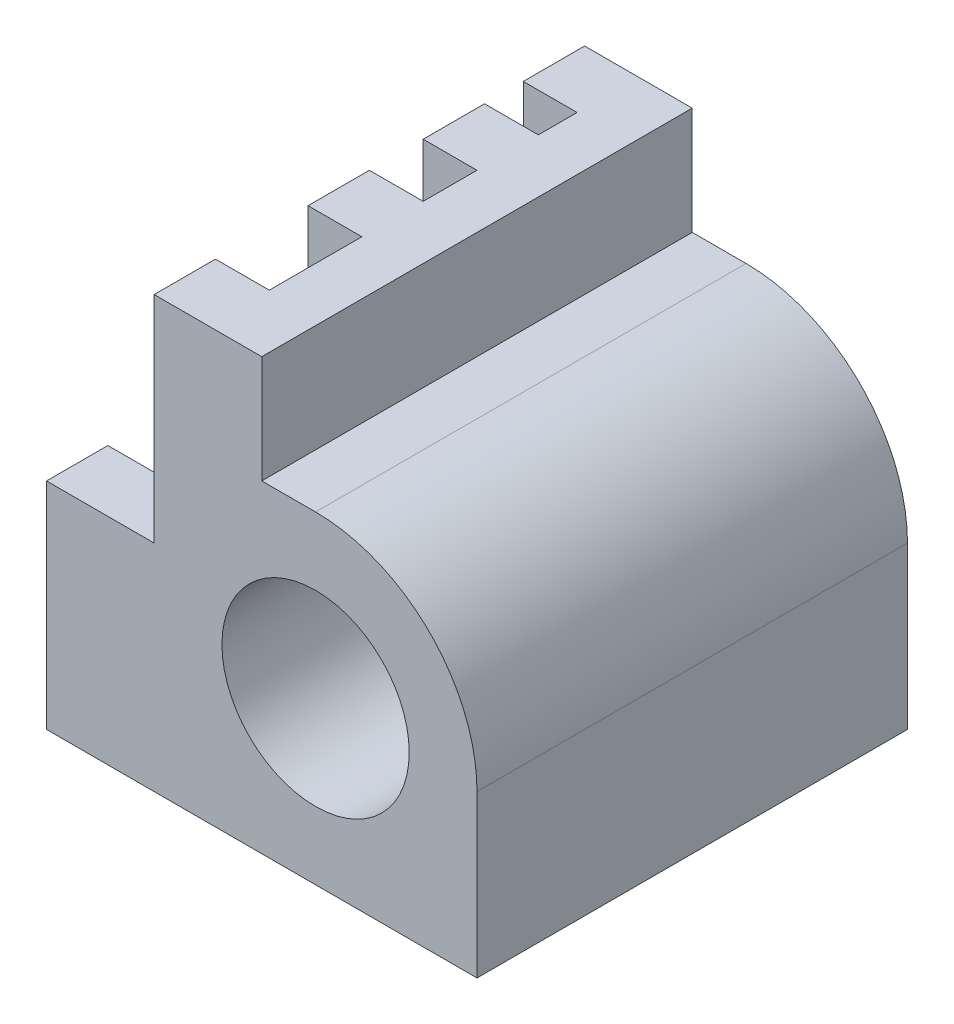
ISO-10303-21;
HEADER;
FILE_DESCRIPTION(('STEP AP214'),'2;1');
FILE_NAME('part.step','',(''),(''),'','','');
FILE_SCHEMA(('AUTOMOTIVE_DESIGN { 1 0 10303 214 1 1 1 1 }'));
ENDSEC;
DATA;
#1=APPLICATION_CONTEXT('core data for automotive mechanical design processes');
#2=APPLICATION_PROTOCOL_DEFINITION('international standard','automotive_design',2000,#1);
#3=PRODUCT_CONTEXT('',#1,'mechanical');
#4=PRODUCT('Part','Part','',(#3));
#5=PRODUCT_RELATED_PRODUCT_CATEGORY('part','',(#4));
#6=PRODUCT_DEFINITION_FORMATION('','',#4);
#7=PRODUCT_DEFINITION_CONTEXT('part definition',#1,'design');
#8=PRODUCT_DEFINITION('design','',#6,#7);
#9=PRODUCT_DEFINITION_SHAPE('','',#8);
#10=(LENGTH_UNIT() NAMED_UNIT(*) SI_UNIT(.MILLI.,.METRE.));
#11=(NAMED_UNIT(*) PLANE_ANGLE_UNIT() SI_UNIT($,.RADIAN.));
#12=(NAMED_UNIT(*) SI_UNIT($,.STERADIAN.) SOLID_ANGLE_UNIT());
#13=UNCERTAINTY_MEASURE_WITH_UNIT(LENGTH_MEASURE(1.E-05),#10,'distance_accuracy_value','');
#14=(GEOMETRIC_REPRESENTATION_CONTEXT(3) GLOBAL_UNCERTAINTY_ASSIGNED_CONTEXT((#13)) GLOBAL_UNIT_ASSIGNED_CONTEXT((#10,
#11,#12)) REPRESENTATION_CONTEXT('',''));
#15=CARTESIAN_POINT('',(0.,0.,0.));
#16=DIRECTION('',(0.,0.,1.));
#17=DIRECTION('',(1.,0.,0.));
#18=AXIS2_PLACEMENT_3D('',#15,#16,#17);
#19=CARTESIAN_POINT('',(5.,20.,20.));
#20=DIRECTION('',(1.,0.,0.));
#21=DIRECTION('',(0.,1.,0.));
#22=AXIS2_PLACEMENT_3D('',#19,#20,#21);
#23=PLANE('',#22);
#24=DIRECTION('',(0.,0.,-1.));
#25=VECTOR('',#24,1.);
#26=CARTESIAN_POINT('',(5.,10.,20.));
#27=LINE('',#26,#25);
#28=CARTESIAN_POINT('',(5.,10.,2.85));
#29=VERTEX_POINT('',#28);
#30=CARTESIAN_POINT('',(5.,10.,0.));
#31=VERTEX_POINT('',#30);
#32=EDGE_CURVE('E375',#29,#31,#27,.T.);
#33=ORIENTED_EDGE('',*,*,#32,.F.);
#34=DIRECTION('',(0.,1.,0.));
#35=VECTOR('',#34,1.);
#36=CARTESIAN_POINT('',(5.,20.,2.85));
#37=LINE('',#36,#35);
#38=CARTESIAN_POINT('',(5.,20.,2.85));
#39=VERTEX_POINT('',#38);
#40=EDGE_CURVE('E321',#29,#39,#37,.T.);
#41=ORIENTED_EDGE('',*,*,#40,.T.);
#42=DIRECTION('',(0.,0.,-1.));
#43=VECTOR('',#42,1.);
#44=CARTESIAN_POINT('',(5.,20.,20.));
#45=LINE('',#44,#43);
#46=CARTESIAN_POINT('',(5.,20.,0.));
#47=VERTEX_POINT('',#46);
#48=EDGE_CURVE('E380',#39,#47,#45,.T.);
#49=ORIENTED_EDGE('',*,*,#48,.T.);
#50=DIRECTION('',(0.,-1.,0.));
#51=VECTOR('',#50,1.);
#52=CARTESIAN_POINT('',(5.,20.,0.));
#53=LINE('',#52,#51);
#54=EDGE_CURVE('E367',#47,#31,#53,.T.);
#55=ORIENTED_EDGE('',*,*,#54,.T.);
#56=EDGE_LOOP('',(#33,#41,#49,#55));
#57=FACE_BOUND('',#56,.T.);
#58=ADVANCED_FACE('F40',(#57),#23,.F.);
#59=CARTESIAN_POINT('',(5.,20.,7.5));
#60=VERTEX_POINT('',#59);
#61=CARTESIAN_POINT('',(5.,20.,4.65));
#62=VERTEX_POINT('',#61);
#63=EDGE_CURVE('E480',#60,#62,#45,.T.);
#64=ORIENTED_EDGE('',*,*,#63,.T.);
#65=DIRECTION('',(0.,-1.,0.));
#66=VECTOR('',#65,1.);
#67=CARTESIAN_POINT('',(5.,20.,4.65));
#68=LINE('',#67,#66);
#69=CARTESIAN_POINT('',(5.,10.,4.65));
#70=VERTEX_POINT('',#69);
#71=EDGE_CURVE('E318',#62,#70,#68,.T.);
#72=ORIENTED_EDGE('',*,*,#71,.T.);
#73=CARTESIAN_POINT('',(5.,10.,7.5));
#74=VERTEX_POINT('',#73);
#75=EDGE_CURVE('E420',#74,#70,#27,.T.);
#76=ORIENTED_EDGE('',*,*,#75,.F.);
#77=DIRECTION('',(0.,1.,0.));
#78=VECTOR('',#77,1.);
#79=CARTESIAN_POINT('',(5.,20.,7.5));
#80=LINE('',#79,#78);
#81=EDGE_CURVE('E315',#74,#60,#80,.T.);
#82=ORIENTED_EDGE('',*,*,#81,.T.);
#83=EDGE_LOOP('',(#64,#72,#76,#82));
#84=FACE_BOUND('',#83,.T.);
#85=ADVANCED_FACE('F513',(#84),#23,.F.);
#86=CARTESIAN_POINT('',(5.,20.,12.85));
#87=VERTEX_POINT('',#86);
#88=CARTESIAN_POINT('',(5.,20.,10.));
#89=VERTEX_POINT('',#88);
#90=EDGE_CURVE('E386',#87,#89,#45,.T.);
#91=ORIENTED_EDGE('',*,*,#90,.T.);
#92=DIRECTION('',(0.,-1.,0.));
#93=VECTOR('',#92,1.);
#94=CARTESIAN_POINT('',(5.,20.,10.));
#95=LINE('',#94,#93);
#96=CARTESIAN_POINT('',(5.,10.,10.));
#97=VERTEX_POINT('',#96);
#98=EDGE_CURVE('E312',#89,#97,#95,.T.);
#99=ORIENTED_EDGE('',*,*,#98,.T.);
#100=CARTESIAN_POINT('',(5.,10.,12.85));
#101=VERTEX_POINT('',#100);
#102=EDGE_CURVE('E381',#101,#97,#27,.T.);
#103=ORIENTED_EDGE('',*,*,#102,.F.);
#104=DIRECTION('',(0.,1.,0.));
#105=VECTOR('',#104,1.);
#106=CARTESIAN_POINT('',(5.,20.,12.85));
#107=LINE('',#106,#105);
#108=EDGE_CURVE('E309',#101,#87,#107,.T.);
#109=ORIENTED_EDGE('',*,*,#108,.T.);
#110=EDGE_LOOP('',(#91,#99,#103,#109));
#111=FACE_BOUND('',#110,.T.);
#112=ADVANCED_FACE('F478',(#111),#23,.F.);
#113=CARTESIAN_POINT('',(5.,10.,20.));
#114=DIRECTION('',(0.,-1.,0.));
#115=DIRECTION('',(0.,0.,-1.));
#116=AXIS2_PLACEMENT_3D('',#113,#114,#115);
#117=PLANE('',#116);
#118=DIRECTION('',(0.,0.,-1.));
#119=VECTOR('',#118,1.);
#120=CARTESIAN_POINT('',(0.,10.,20.));
#121=LINE('',#120,#119);
#122=CARTESIAN_POINT('',(0.,10.,2.85));
#123=VERTEX_POINT('',#122);
#124=CARTESIAN_POINT('',(0.,10.,0.));
#125=VERTEX_POINT('',#124);
#126=EDGE_CURVE('E351',#123,#125,#121,.T.);
#127=ORIENTED_EDGE('',*,*,#126,.F.);
#128=DIRECTION('',(1.,0.,0.));
#129=VECTOR('',#128,1.);
#130=CARTESIAN_POINT('',(5.,10.,2.85));
#131=LINE('',#130,#129);
#132=EDGE_CURVE('E13',#123,#29,#131,.T.);
#133=ORIENTED_EDGE('',*,*,#132,.T.);
#134=ORIENTED_EDGE('',*,*,#32,.T.);
#135=DIRECTION('',(-1.,0.,0.));
#136=VECTOR('',#135,1.);
#137=CARTESIAN_POINT('',(5.,10.,0.));
#138=LINE('',#137,#136);
#139=EDGE_CURVE('E335',#31,#125,#138,.T.);
#140=ORIENTED_EDGE('',*,*,#139,.T.);
#141=EDGE_LOOP('',(#127,#133,#134,#140));
#142=FACE_BOUND('',#141,.T.);
#143=ADVANCED_FACE('F427',(#142),#117,.F.);
#144=ORIENTED_EDGE('',*,*,#75,.T.);
#145=DIRECTION('',(-1.,0.,0.));
#146=VECTOR('',#145,1.);
#147=CARTESIAN_POINT('',(5.,10.,4.65));
#148=LINE('',#147,#146);
#149=CARTESIAN_POINT('',(0.,10.,4.65));
#150=VERTEX_POINT('',#149);
#151=EDGE_CURVE('E48',#70,#150,#148,.T.);
#152=ORIENTED_EDGE('',*,*,#151,.T.);
#153=CARTESIAN_POINT('',(0.,10.,7.5));
#154=VERTEX_POINT('',#153);
#155=EDGE_CURVE('E418',#154,#150,#121,.T.);
#156=ORIENTED_EDGE('',*,*,#155,.F.);
#157=DIRECTION('',(1.,0.,0.));
#158=VECTOR('',#157,1.);
#159=CARTESIAN_POINT('',(5.,10.,7.5));
#160=LINE('',#159,#158);
#161=EDGE_CURVE('E412',#154,#74,#160,.T.);
#162=ORIENTED_EDGE('',*,*,#161,.T.);
#163=EDGE_LOOP('',(#144,#152,#156,#162));
#164=FACE_BOUND('',#163,.T.);
#165=ADVANCED_FACE('F417',(#164),#117,.F.);
#166=ORIENTED_EDGE('',*,*,#102,.T.);
#167=DIRECTION('',(-1.,0.,0.));
#168=VECTOR('',#167,1.);
#169=CARTESIAN_POINT('',(5.,10.,10.));
#170=LINE('',#169,#168);
#171=CARTESIAN_POINT('',(0.,10.,10.));
#172=VERTEX_POINT('',#171);
#173=EDGE_CURVE('E410',#97,#172,#170,.T.);
#174=ORIENTED_EDGE('',*,*,#173,.T.);
#175=CARTESIAN_POINT('',(0.,10.,12.85));
#176=VERTEX_POINT('',#175);
#177=EDGE_CURVE('E376',#176,#172,#121,.T.);
#178=ORIENTED_EDGE('',*,*,#177,.F.);
#179=DIRECTION('',(1.,0.,0.));
#180=VECTOR('',#179,1.);
#181=CARTESIAN_POINT('',(5.,10.,12.85));
#182=LINE('',#181,#180);
#183=EDGE_CURVE('E407',#176,#101,#182,.T.);
#184=ORIENTED_EDGE('',*,*,#183,.T.);
#185=EDGE_LOOP('',(#166,#174,#178,#184));
#186=FACE_BOUND('',#185,.T.);
#187=ADVANCED_FACE('F472',(#186),#117,.F.);
#188=CARTESIAN_POINT('',(12.5,7.5,20.));
#189=DIRECTION('',(0.,0.,1.));
#190=DIRECTION('',(1.,0.,0.));
#191=AXIS2_PLACEMENT_3D('',#188,#189,#190);
#192=PLANE('',#191);
#193=DIRECTION('',(0.,-1.,0.));
#194=VECTOR('',#193,1.);
#195=CARTESIAN_POINT('',(0.,10.,20.));
#196=LINE('',#195,#194);
#197=CARTESIAN_POINT('',(0.,10.,20.));
#198=VERTEX_POINT('',#197);
#199=CARTESIAN_POINT('',(0.,0.,20.));
#200=VERTEX_POINT('',#199);
#201=EDGE_CURVE('E331',#198,#200,#196,.T.);
#202=ORIENTED_EDGE('',*,*,#201,.T.);
#203=DIRECTION('',(1.,0.,0.));
#204=VECTOR('',#203,1.);
#205=CARTESIAN_POINT('',(0.,0.,20.));
#206=LINE('',#205,#204);
#207=CARTESIAN_POINT('',(20.,0.,20.));
#208=VERTEX_POINT('',#207);
#209=EDGE_CURVE('E334',#200,#208,#206,.T.);
#210=ORIENTED_EDGE('',*,*,#209,.T.);
#211=DIRECTION('',(0.,1.,0.));
#212=VECTOR('',#211,1.);
#213=CARTESIAN_POINT('',(20.,0.,20.));
#214=LINE('',#213,#212);
#215=CARTESIAN_POINT('',(20.,7.5,20.));
#216=VERTEX_POINT('',#215);
#217=EDGE_CURVE('E337',#208,#216,#214,.T.);
#218=ORIENTED_EDGE('',*,*,#217,.T.);
#219=CARTESIAN_POINT('',(12.5,7.5,20.));
#220=DIRECTION('',(0.,0.,1.));
#221=DIRECTION('',(1.,0.,0.));
#222=AXIS2_PLACEMENT_3D('',#219,#220,#221);
#223=CIRCLE('',#222,7.5);
#224=CARTESIAN_POINT('',(12.5,15.,20.));
#225=VERTEX_POINT('',#224);
#226=EDGE_CURVE('E339',#216,#225,#223,.T.);
#227=ORIENTED_EDGE('',*,*,#226,.T.);
#228=DIRECTION('',(-1.,0.,0.));
#229=VECTOR('',#228,1.);
#230=CARTESIAN_POINT('',(12.5,15.,20.));
#231=LINE('',#230,#229);
#232=CARTESIAN_POINT('',(10.,15.,20.));
#233=VERTEX_POINT('',#232);
#234=EDGE_CURVE('E341',#225,#233,#231,.T.);
#235=ORIENTED_EDGE('',*,*,#234,.T.);
#236=DIRECTION('',(0.,1.,0.));
#237=VECTOR('',#236,1.);
#238=CARTESIAN_POINT('',(10.,15.,20.));
#239=LINE('',#238,#237);
#240=CARTESIAN_POINT('',(10.,20.,20.));
#241=VERTEX_POINT('',#240);
#242=EDGE_CURVE('E343',#233,#241,#239,.T.);
#243=ORIENTED_EDGE('',*,*,#242,.T.);
#244=DIRECTION('',(-1.,0.,0.));
#245=VECTOR('',#244,1.);
#246=CARTESIAN_POINT('',(10.,20.,20.));
#247=LINE('',#246,#245);
#248=CARTESIAN_POINT('',(5.,20.,20.));
#249=VERTEX_POINT('',#248);
#250=EDGE_CURVE('E345',#241,#249,#247,.T.);
#251=ORIENTED_EDGE('',*,*,#250,.T.);
#252=DIRECTION('',(0.,-1.,0.));
#253=VECTOR('',#252,1.);
#254=CARTESIAN_POINT('',(5.,20.,20.));
#255=LINE('',#254,#253);
#256=CARTESIAN_POINT('',(5.,10.,20.));
#257=VERTEX_POINT('',#256);
#258=EDGE_CURVE('E347',#249,#257,#255,.T.);
#259=ORIENTED_EDGE('',*,*,#258,.T.);
#260=DIRECTION('',(-1.,0.,0.));
#261=VECTOR('',#260,1.);
#262=CARTESIAN_POINT('',(5.,10.,20.));
#263=LINE('',#262,#261);
#264=EDGE_CURVE('E349',#257,#198,#263,.T.);
#265=ORIENTED_EDGE('',*,*,#264,.T.);
#266=EDGE_LOOP('',(#202,#210,#218,#227,#235,#243,#251,#259,#265));
#267=FACE_BOUND('',#266,.T.);
#268=CARTESIAN_POINT('',(12.5,7.5,20.));
#269=DIRECTION('',(0.,0.,1.));
#270=DIRECTION('',(1.,0.,0.));
#271=AXIS2_PLACEMENT_3D('',#268,#269,#270);
#272=CIRCLE('',#271,4.35);
#273=CARTESIAN_POINT('',(16.85,7.5,20.));
#274=VERTEX_POINT('',#273);
#275=EDGE_CURVE('E325',#274,#274,#272,.T.);
#276=ORIENTED_EDGE('',*,*,#275,.F.);
#277=EDGE_LOOP('',(#276));
#278=FACE_BOUND('',#277,.T.);
#279=ADVANCED_FACE('F442',(#267,#278),#192,.T.);
#280=CARTESIAN_POINT('',(12.5,7.5,0.));
#281=DIRECTION('',(0.,0.,1.));
#282=DIRECTION('',(1.,0.,0.));
#283=AXIS2_PLACEMENT_3D('',#280,#281,#282);
#284=PLANE('',#283);
#285=DIRECTION('',(0.,-1.,0.));
#286=VECTOR('',#285,1.);
#287=CARTESIAN_POINT('',(0.,10.,0.));
#288=LINE('',#287,#286);
#289=CARTESIAN_POINT('',(0.,0.,0.));
#290=VERTEX_POINT('',#289);
#291=EDGE_CURVE('E328',#125,#290,#288,.T.);
#292=ORIENTED_EDGE('',*,*,#291,.F.);
#293=ORIENTED_EDGE('',*,*,#139,.F.);
#294=ORIENTED_EDGE('',*,*,#54,.F.);
#295=DIRECTION('',(-1.,0.,0.));
#296=VECTOR('',#295,1.);
#297=CARTESIAN_POINT('',(10.,20.,0.));
#298=LINE('',#297,#296);
#299=CARTESIAN_POINT('',(10.,20.,0.));
#300=VERTEX_POINT('',#299);
#301=EDGE_CURVE('E364',#300,#47,#298,.T.);
#302=ORIENTED_EDGE('',*,*,#301,.F.);
#303=DIRECTION('',(0.,1.,0.));
#304=VECTOR('',#303,1.);
#305=CARTESIAN_POINT('',(10.,15.,0.));
#306=LINE('',#305,#304);
#307=CARTESIAN_POINT('',(10.,15.,0.));
#308=VERTEX_POINT('',#307);
#309=EDGE_CURVE('E362',#308,#300,#306,.T.);
#310=ORIENTED_EDGE('',*,*,#309,.F.);
#311=DIRECTION('',(-1.,0.,0.));
#312=VECTOR('',#311,1.);
#313=CARTESIAN_POINT('',(12.5,15.,0.));
#314=LINE('',#313,#312);
#315=CARTESIAN_POINT('',(12.5,15.,0.));
#316=VERTEX_POINT('',#315);
#317=EDGE_CURVE('E360',#316,#308,#314,.T.);
#318=ORIENTED_EDGE('',*,*,#317,.F.);
#319=CARTESIAN_POINT('',(12.5,7.5,0.));
#320=DIRECTION('',(0.,0.,1.));
#321=DIRECTION('',(1.,0.,0.));
#322=AXIS2_PLACEMENT_3D('',#319,#320,#321);
#323=CIRCLE('',#322,7.5);
#324=CARTESIAN_POINT('',(20.,7.5,0.));
#325=VERTEX_POINT('',#324);
#326=EDGE_CURVE('E358',#325,#316,#323,.T.);
#327=ORIENTED_EDGE('',*,*,#326,.F.);
#328=DIRECTION('',(0.,1.,0.));
#329=VECTOR('',#328,1.);
#330=CARTESIAN_POINT('',(20.,0.,0.));
#331=LINE('',#330,#329);
#332=CARTESIAN_POINT('',(20.,0.,0.));
#333=VERTEX_POINT('',#332);
#334=EDGE_CURVE('E356',#333,#325,#331,.T.);
#335=ORIENTED_EDGE('',*,*,#334,.F.);
#336=DIRECTION('',(1.,0.,0.));
#337=VECTOR('',#336,1.);
#338=CARTESIAN_POINT('',(0.,0.,0.));
#339=LINE('',#338,#337);
#340=EDGE_CURVE('E354',#290,#333,#339,.T.);
#341=ORIENTED_EDGE('',*,*,#340,.F.);
#342=EDGE_LOOP('',(#292,#293,#294,#302,#310,#318,#327,#335,#341));
#343=FACE_BOUND('',#342,.T.);
#344=CARTESIAN_POINT('',(12.5,7.5,0.));
#345=DIRECTION('',(0.,0.,1.));
#346=DIRECTION('',(1.,0.,0.));
#347=AXIS2_PLACEMENT_3D('',#344,#345,#346);
#348=CIRCLE('',#347,4.35);
#349=CARTESIAN_POINT('',(16.85,7.5,0.));
#350=VERTEX_POINT('',#349);
#351=EDGE_CURVE('E324',#350,#350,#348,.T.);
#352=ORIENTED_EDGE('',*,*,#351,.T.);
#353=EDGE_LOOP('',(#352));
#354=FACE_BOUND('',#353,.T.);
#355=ADVANCED_FACE('F431',(#343,#354),#284,.F.);
#356=CARTESIAN_POINT('',(0.,10.,20.));
#357=DIRECTION('',(1.,0.,0.));
#358=DIRECTION('',(0.,1.,0.));
#359=AXIS2_PLACEMENT_3D('',#356,#357,#358);
#360=PLANE('',#359);
#361=DIRECTION('',(0.,0.,1.));
#362=VECTOR('',#361,1.);
#363=CARTESIAN_POINT('',(0.,7.5,2.85));
#364=LINE('',#363,#362);
#365=CARTESIAN_POINT('',(0.,7.5,2.85));
#366=VERTEX_POINT('',#365);
#367=CARTESIAN_POINT('',(0.,7.5,4.65));
#368=VERTEX_POINT('',#367);
#369=EDGE_CURVE('E226',#366,#368,#364,.T.);
#370=ORIENTED_EDGE('',*,*,#369,.F.);
#371=DIRECTION('',(0.,1.,0.));
#372=VECTOR('',#371,1.);
#373=CARTESIAN_POINT('',(0.,-3.64522989862039,2.85));
#374=LINE('',#373,#372);
#375=EDGE_CURVE('E218',#366,#123,#374,.T.);
#376=ORIENTED_EDGE('',*,*,#375,.T.);
#377=ORIENTED_EDGE('',*,*,#126,.T.);
#378=ORIENTED_EDGE('',*,*,#291,.T.);
#379=DIRECTION('',(0.,0.,-1.));
#380=VECTOR('',#379,1.);
#381=CARTESIAN_POINT('',(0.,0.,20.));
#382=LINE('',#381,#380);
#383=EDGE_CURVE('E401',#200,#290,#382,.T.);
#384=ORIENTED_EDGE('',*,*,#383,.F.);
#385=ORIENTED_EDGE('',*,*,#201,.F.);
#386=CARTESIAN_POINT('',(0.,10.,17.15));
#387=VERTEX_POINT('',#386);
#388=EDGE_CURVE('E372',#198,#387,#121,.T.);
#389=ORIENTED_EDGE('',*,*,#388,.T.);
#390=DIRECTION('',(0.,1.,0.));
#391=VECTOR('',#390,1.);
#392=CARTESIAN_POINT('',(0.,-3.64522989862039,17.15));
#393=LINE('',#392,#391);
#394=CARTESIAN_POINT('',(0.,7.5,17.15));
#395=VERTEX_POINT('',#394);
#396=EDGE_CURVE('E297',#395,#387,#393,.T.);
#397=ORIENTED_EDGE('',*,*,#396,.F.);
#398=DIRECTION('',(0.,0.,1.));
#399=VECTOR('',#398,1.);
#400=CARTESIAN_POINT('',(0.,7.5,12.85));
#401=LINE('',#400,#399);
#402=CARTESIAN_POINT('',(0.,7.5,12.85));
#403=VERTEX_POINT('',#402);
#404=EDGE_CURVE('E298',#403,#395,#401,.T.);
#405=ORIENTED_EDGE('',*,*,#404,.F.);
#406=DIRECTION('',(0.,1.,0.));
#407=VECTOR('',#406,1.);
#408=CARTESIAN_POINT('',(0.,-3.64522989862039,12.85));
#409=LINE('',#408,#407);
#410=EDGE_CURVE('E289',#403,#176,#409,.T.);
#411=ORIENTED_EDGE('',*,*,#410,.T.);
#412=ORIENTED_EDGE('',*,*,#177,.T.);
#413=DIRECTION('',(0.,1.,0.));
#414=VECTOR('',#413,1.);
#415=CARTESIAN_POINT('',(0.,-3.64522989862039,10.));
#416=LINE('',#415,#414);
#417=CARTESIAN_POINT('',(0.,7.5,10.));
#418=VERTEX_POINT('',#417);
#419=EDGE_CURVE('E63',#418,#172,#416,.T.);
#420=ORIENTED_EDGE('',*,*,#419,.F.);
#421=DIRECTION('',(0.,0.,1.));
#422=VECTOR('',#421,1.);
#423=CARTESIAN_POINT('',(0.,7.5,7.5));
#424=LINE('',#423,#422);
#425=CARTESIAN_POINT('',(0.,7.5,7.5));
#426=VERTEX_POINT('',#425);
#427=EDGE_CURVE('E269',#426,#418,#424,.T.);
#428=ORIENTED_EDGE('',*,*,#427,.F.);
#429=DIRECTION('',(0.,1.,0.));
#430=VECTOR('',#429,1.);
#431=CARTESIAN_POINT('',(0.,-3.64522989862039,7.5));
#432=LINE('',#431,#430);
#433=EDGE_CURVE('E260',#426,#154,#432,.T.);
#434=ORIENTED_EDGE('',*,*,#433,.T.);
#435=ORIENTED_EDGE('',*,*,#155,.T.);
#436=DIRECTION('',(0.,1.,0.));
#437=VECTOR('',#436,1.);
#438=CARTESIAN_POINT('',(0.,-3.64522989862039,4.65));
#439=LINE('',#438,#437);
#440=EDGE_CURVE('E55',#368,#150,#439,.T.);
#441=ORIENTED_EDGE('',*,*,#440,.F.);
#442=EDGE_LOOP('',(#370,#376,#377,#378,#384,#385,#389,#397,#405,#411,#412,#420,#428,#434,#435,#441));
#443=FACE_BOUND('',#442,.T.);
#444=ADVANCED_FACE('F42',(#443),#360,.F.);
#445=CARTESIAN_POINT('',(0.,0.,20.));
#446=DIRECTION('',(0.,1.,0.));
#447=DIRECTION('',(0.,0.,1.));
#448=AXIS2_PLACEMENT_3D('',#445,#446,#447);
#449=PLANE('',#448);
#450=ORIENTED_EDGE('',*,*,#340,.T.);
#451=DIRECTION('',(0.,0.,-1.));
#452=VECTOR('',#451,1.);
#453=CARTESIAN_POINT('',(20.,0.,20.));
#454=LINE('',#453,#452);
#455=EDGE_CURVE('E398',#208,#333,#454,.T.);
#456=ORIENTED_EDGE('',*,*,#455,.F.);
#457=ORIENTED_EDGE('',*,*,#209,.F.);
#458=ORIENTED_EDGE('',*,*,#383,.T.);
#459=EDGE_LOOP('',(#450,#456,#457,#458));
#460=FACE_BOUND('',#459,.T.);
#461=ADVANCED_FACE('F437',(#460),#449,.F.);
#462=CARTESIAN_POINT('',(20.,0.,20.));
#463=DIRECTION('',(-1.,0.,0.));
#464=DIRECTION('',(0.,0.,1.));
#465=AXIS2_PLACEMENT_3D('',#462,#463,#464);
#466=PLANE('',#465);
#467=ORIENTED_EDGE('',*,*,#334,.T.);
#468=DIRECTION('',(0.,0.,-1.));
#469=VECTOR('',#468,1.);
#470=CARTESIAN_POINT('',(20.,7.5,20.));
#471=LINE('',#470,#469);
#472=EDGE_CURVE('E395',#216,#325,#471,.T.);
#473=ORIENTED_EDGE('',*,*,#472,.F.);
#474=ORIENTED_EDGE('',*,*,#217,.F.);
#475=ORIENTED_EDGE('',*,*,#455,.T.);
#476=EDGE_LOOP('',(#467,#473,#474,#475));
#477=FACE_BOUND('',#476,.T.);
#478=ADVANCED_FACE('F504',(#477),#466,.F.);
#479=CARTESIAN_POINT('',(12.5,7.5,20.));
#480=DIRECTION('',(0.,0.,-1.));
#481=DIRECTION('',(-1.,0.,0.));
#482=AXIS2_PLACEMENT_3D('',#479,#480,#481);
#483=CYLINDRICAL_SURFACE('',#482,7.5);
#484=ORIENTED_EDGE('',*,*,#326,.T.);
#485=DIRECTION('',(0.,0.,-1.));
#486=VECTOR('',#485,1.);
#487=CARTESIAN_POINT('',(12.5,15.,20.));
#488=LINE('',#487,#486);
#489=EDGE_CURVE('E392',#225,#316,#488,.T.);
#490=ORIENTED_EDGE('',*,*,#489,.F.);
#491=ORIENTED_EDGE('',*,*,#226,.F.);
#492=ORIENTED_EDGE('',*,*,#472,.T.);
#493=EDGE_LOOP('',(#484,#490,#491,#492));
#494=FACE_BOUND('',#493,.T.);
#495=ADVANCED_FACE('F500',(#494),#483,.T.);
#496=CARTESIAN_POINT('',(12.5,15.,20.));
#497=DIRECTION('',(0.,-1.,0.));
#498=DIRECTION('',(0.,0.,-1.));
#499=AXIS2_PLACEMENT_3D('',#496,#497,#498);
#500=PLANE('',#499);
#501=ORIENTED_EDGE('',*,*,#317,.T.);
#502=DIRECTION('',(0.,0.,-1.));
#503=VECTOR('',#502,1.);
#504=CARTESIAN_POINT('',(10.,15.,20.));
#505=LINE('',#504,#503);
#506=EDGE_CURVE('E389',#233,#308,#505,.T.);
#507=ORIENTED_EDGE('',*,*,#506,.F.);
#508=ORIENTED_EDGE('',*,*,#234,.F.);
#509=ORIENTED_EDGE('',*,*,#489,.T.);
#510=EDGE_LOOP('',(#501,#507,#508,#509));
#511=FACE_BOUND('',#510,.T.);
#512=ADVANCED_FACE('F496',(#511),#500,.F.);
#513=CARTESIAN_POINT('',(10.,15.,20.));
#514=DIRECTION('',(-1.,0.,0.));
#515=DIRECTION('',(0.,0.,1.));
#516=AXIS2_PLACEMENT_3D('',#513,#514,#515);
#517=PLANE('',#516);
#518=ORIENTED_EDGE('',*,*,#309,.T.);
#519=DIRECTION('',(0.,0.,-1.));
#520=VECTOR('',#519,1.);
#521=CARTESIAN_POINT('',(10.,20.,20.));
#522=LINE('',#521,#520);
#523=EDGE_CURVE('E385',#241,#300,#522,.T.);
#524=ORIENTED_EDGE('',*,*,#523,.F.);
#525=ORIENTED_EDGE('',*,*,#242,.F.);
#526=ORIENTED_EDGE('',*,*,#506,.T.);
#527=EDGE_LOOP('',(#518,#524,#525,#526));
#528=FACE_BOUND('',#527,.T.);
#529=ADVANCED_FACE('F491',(#528),#517,.F.);
#530=CARTESIAN_POINT('',(10.,20.,20.));
#531=DIRECTION('',(0.,-1.,0.));
#532=DIRECTION('',(1.,0.,0.));
#533=AXIS2_PLACEMENT_3D('',#530,#531,#532);
#534=PLANE('',#533);
#535=ORIENTED_EDGE('',*,*,#48,.F.);
#536=DIRECTION('',(-1.,0.,0.));
#537=VECTOR('',#536,1.);
#538=CARTESIAN_POINT('',(7.50000000000001,20.,2.85));
#539=LINE('',#538,#537);
#540=CARTESIAN_POINT('',(7.50000000000001,20.,2.85));
#541=VERTEX_POINT('',#540);
#542=EDGE_CURVE('E580',#541,#39,#539,.T.);
#543=ORIENTED_EDGE('',*,*,#542,.F.);
#544=DIRECTION('',(0.,0.,-1.));
#545=VECTOR('',#544,1.);
#546=CARTESIAN_POINT('',(7.50000000000001,20.,2.85));
#547=LINE('',#546,#545);
#548=CARTESIAN_POINT('',(7.50000000000001,20.,4.65));
#549=VERTEX_POINT('',#548);
#550=EDGE_CURVE('E278',#549,#541,#547,.T.);
#551=ORIENTED_EDGE('',*,*,#550,.F.);
#552=DIRECTION('',(1.,0.,0.));
#553=VECTOR('',#552,1.);
#554=CARTESIAN_POINT('',(7.50000000000001,20.,4.65));
#555=LINE('',#554,#553);
#556=EDGE_CURVE('E234',#62,#549,#555,.T.);
#557=ORIENTED_EDGE('',*,*,#556,.F.);
#558=ORIENTED_EDGE('',*,*,#63,.F.);
#559=DIRECTION('',(-1.,0.,0.));
#560=VECTOR('',#559,1.);
#561=CARTESIAN_POINT('',(7.50000000000001,20.,7.5));
#562=LINE('',#561,#560);
#563=CARTESIAN_POINT('',(7.50000000000001,20.,7.5));
#564=VERTEX_POINT('',#563);
#565=EDGE_CURVE('E252',#564,#60,#562,.T.);
#566=ORIENTED_EDGE('',*,*,#565,.F.);
#567=DIRECTION('',(0.,0.,-1.));
#568=VECTOR('',#567,1.);
#569=CARTESIAN_POINT('',(7.50000000000001,20.,7.5));
#570=LINE('',#569,#568);
#571=CARTESIAN_POINT('',(7.50000000000001,20.,10.));
#572=VERTEX_POINT('',#571);
#573=EDGE_CURVE('E254',#572,#564,#570,.T.);
#574=ORIENTED_EDGE('',*,*,#573,.F.);
#575=DIRECTION('',(1.,0.,0.));
#576=VECTOR('',#575,1.);
#577=CARTESIAN_POINT('',(7.50000000000001,20.,10.));
#578=LINE('',#577,#576);
#579=EDGE_CURVE('E249',#89,#572,#578,.T.);
#580=ORIENTED_EDGE('',*,*,#579,.F.);
#581=ORIENTED_EDGE('',*,*,#90,.F.);
#582=DIRECTION('',(-1.,0.,0.));
#583=VECTOR('',#582,1.);
#584=CARTESIAN_POINT('',(7.50000000000001,20.,12.85));
#585=LINE('',#584,#583);
#586=CARTESIAN_POINT('',(7.50000000000001,20.,12.85));
#587=VERTEX_POINT('',#586);
#588=EDGE_CURVE('E282',#587,#87,#585,.T.);
#589=ORIENTED_EDGE('',*,*,#588,.F.);
#590=DIRECTION('',(0.,0.,-1.));
#591=VECTOR('',#590,1.);
#592=CARTESIAN_POINT('',(7.50000000000001,20.,12.85));
#593=LINE('',#592,#591);
#594=CARTESIAN_POINT('',(7.50000000000001,20.,17.15));
#595=VERTEX_POINT('',#594);
#596=EDGE_CURVE('E284',#595,#587,#593,.T.);
#597=ORIENTED_EDGE('',*,*,#596,.F.);
#598=DIRECTION('',(1.,0.,0.));
#599=VECTOR('',#598,1.);
#600=CARTESIAN_POINT('',(7.50000000000001,20.,17.15));
#601=LINE('',#600,#599);
#602=CARTESIAN_POINT('',(5.,20.,17.15));
#603=VERTEX_POINT('',#602);
#604=EDGE_CURVE('E279',#603,#595,#601,.T.);
#605=ORIENTED_EDGE('',*,*,#604,.F.);
#606=EDGE_CURVE('E382',#249,#603,#45,.T.);
#607=ORIENTED_EDGE('',*,*,#606,.F.);
#608=ORIENTED_EDGE('',*,*,#250,.F.);
#609=ORIENTED_EDGE('',*,*,#523,.T.);
#610=ORIENTED_EDGE('',*,*,#301,.T.);
#611=EDGE_LOOP('',(#535,#543,#551,#557,#558,#566,#574,#580,#581,#589,#597,#605,#607,#608,#609,#610));
#612=FACE_BOUND('',#611,.T.);
#613=ADVANCED_FACE('F458',(#612),#534,.F.);
#614=ORIENTED_EDGE('',*,*,#606,.T.);
#615=DIRECTION('',(0.,-1.,0.));
#616=VECTOR('',#615,1.);
#617=CARTESIAN_POINT('',(5.,20.,17.15));
#618=LINE('',#617,#616);
#619=CARTESIAN_POINT('',(5.,10.,17.15));
#620=VERTEX_POINT('',#619);
#621=EDGE_CURVE('E248',#603,#620,#618,.T.);
#622=ORIENTED_EDGE('',*,*,#621,.T.);
#623=EDGE_CURVE('E377',#257,#620,#27,.T.);
#624=ORIENTED_EDGE('',*,*,#623,.F.);
#625=ORIENTED_EDGE('',*,*,#258,.F.);
#626=EDGE_LOOP('',(#614,#622,#624,#625));
#627=FACE_BOUND('',#626,.T.);
#628=ADVANCED_FACE('F453',(#627),#23,.F.);
#629=ORIENTED_EDGE('',*,*,#623,.T.);
#630=DIRECTION('',(-1.,0.,0.));
#631=VECTOR('',#630,1.);
#632=CARTESIAN_POINT('',(5.,10.,17.15));
#633=LINE('',#632,#631);
#634=EDGE_CURVE('E404',#620,#387,#633,.T.);
#635=ORIENTED_EDGE('',*,*,#634,.T.);
#636=ORIENTED_EDGE('',*,*,#388,.F.);
#637=ORIENTED_EDGE('',*,*,#264,.F.);
#638=EDGE_LOOP('',(#629,#635,#636,#637));
#639=FACE_BOUND('',#638,.T.);
#640=ADVANCED_FACE('F448',(#639),#117,.F.);
#641=CARTESIAN_POINT('',(12.5,7.5,20.));
#642=DIRECTION('',(0.,0.,-1.));
#643=DIRECTION('',(-1.,0.,0.));
#644=AXIS2_PLACEMENT_3D('',#641,#642,#643);
#645=CYLINDRICAL_SURFACE('',#644,4.35);
#646=ORIENTED_EDGE('',*,*,#275,.T.);
#647=EDGE_LOOP('',(#646));
#648=FACE_BOUND('',#647,.T.);
#649=ORIENTED_EDGE('',*,*,#351,.F.);
#650=EDGE_LOOP('',(#649));
#651=FACE_BOUND('',#650,.T.);
#652=ADVANCED_FACE('F525',(#648,#651),#645,.F.);
#653=CARTESIAN_POINT('',(7.49999999999999,-3.64522989862039,12.85));
#654=DIRECTION('',(0.,0.,-1.));
#655=DIRECTION('',(-1.,0.,0.));
#656=AXIS2_PLACEMENT_3D('',#653,#654,#655);
#657=PLANE('',#656);
#658=ORIENTED_EDGE('',*,*,#183,.F.);
#659=ORIENTED_EDGE('',*,*,#410,.F.);
#660=DIRECTION('',(-1.,0.,0.));
#661=VECTOR('',#660,1.);
#662=CARTESIAN_POINT('',(7.49999999999999,7.5,12.85));
#663=LINE('',#662,#661);
#664=CARTESIAN_POINT('',(7.50000000000001,7.5,12.85));
#665=VERTEX_POINT('',#664);
#666=EDGE_CURVE('E281',#665,#403,#663,.T.);
#667=ORIENTED_EDGE('',*,*,#666,.F.);
#668=DIRECTION('',(0.,1.,0.));
#669=VECTOR('',#668,1.);
#670=CARTESIAN_POINT('',(7.49999999999999,-3.64522989862039,12.85));
#671=LINE('',#670,#669);
#672=EDGE_CURVE('E257',#665,#587,#671,.T.);
#673=ORIENTED_EDGE('',*,*,#672,.T.);
#674=ORIENTED_EDGE('',*,*,#588,.T.);
#675=ORIENTED_EDGE('',*,*,#108,.F.);
#676=EDGE_LOOP('',(#658,#659,#667,#673,#674,#675));
#677=FACE_BOUND('',#676,.T.);
#678=ADVANCED_FACE('F540',(#677),#657,.F.);
#679=CARTESIAN_POINT('',(7.49999999999999,-3.64522989862039,17.15));
#680=DIRECTION('',(0.,0.,1.));
#681=DIRECTION('',(1.,0.,0.));
#682=AXIS2_PLACEMENT_3D('',#679,#680,#681);
#683=PLANE('',#682);
#684=ORIENTED_EDGE('',*,*,#604,.T.);
#685=DIRECTION('',(0.,1.,0.));
#686=VECTOR('',#685,1.);
#687=CARTESIAN_POINT('',(7.49999999999999,-3.64522989862039,17.15));
#688=LINE('',#687,#686);
#689=CARTESIAN_POINT('',(7.50000000000001,7.5,17.15));
#690=VERTEX_POINT('',#689);
#691=EDGE_CURVE('E293',#690,#595,#688,.T.);
#692=ORIENTED_EDGE('',*,*,#691,.F.);
#693=DIRECTION('',(1.,0.,0.));
#694=VECTOR('',#693,1.);
#695=CARTESIAN_POINT('',(7.49999999999999,7.5,17.15));
#696=LINE('',#695,#694);
#697=EDGE_CURVE('E294',#395,#690,#696,.T.);
#698=ORIENTED_EDGE('',*,*,#697,.F.);
#699=ORIENTED_EDGE('',*,*,#396,.T.);
#700=ORIENTED_EDGE('',*,*,#634,.F.);
#701=ORIENTED_EDGE('',*,*,#621,.F.);
#702=EDGE_LOOP('',(#684,#692,#698,#699,#700,#701));
#703=FACE_BOUND('',#702,.T.);
#704=ADVANCED_FACE('F450',(#703),#683,.F.);
#705=CARTESIAN_POINT('',(5.,7.5,20.));
#706=DIRECTION('',(0.,-1.,0.));
#707=DIRECTION('',(0.,0.,-1.));
#708=AXIS2_PLACEMENT_3D('',#705,#706,#707);
#709=PLANE('',#708);
#710=DIRECTION('',(0.,0.,-1.));
#711=VECTOR('',#710,1.);
#712=CARTESIAN_POINT('',(7.5,7.5,12.85));
#713=LINE('',#712,#711);
#714=EDGE_CURVE('E290',#690,#665,#713,.T.);
#715=ORIENTED_EDGE('',*,*,#714,.T.);
#716=ORIENTED_EDGE('',*,*,#666,.T.);
#717=ORIENTED_EDGE('',*,*,#404,.T.);
#718=ORIENTED_EDGE('',*,*,#697,.T.);
#719=EDGE_LOOP('',(#715,#716,#717,#718));
#720=FACE_BOUND('',#719,.T.);
#721=ADVANCED_FACE('F466',(#720),#709,.F.);
#722=CARTESIAN_POINT('',(7.49999999999999,-3.64522989862039,12.85));
#723=DIRECTION('',(1.,0.,0.));
#724=DIRECTION('',(0.,1.,0.));
#725=AXIS2_PLACEMENT_3D('',#722,#723,#724);
#726=PLANE('',#725);
#727=ORIENTED_EDGE('',*,*,#691,.T.);
#728=ORIENTED_EDGE('',*,*,#596,.T.);
#729=ORIENTED_EDGE('',*,*,#672,.F.);
#730=ORIENTED_EDGE('',*,*,#714,.F.);
#731=EDGE_LOOP('',(#727,#728,#729,#730));
#732=FACE_BOUND('',#731,.T.);
#733=ADVANCED_FACE('F463',(#732),#726,.F.);
#734=CARTESIAN_POINT('',(7.49999999999999,-3.64522989862039,7.5));
#735=DIRECTION('',(0.,0.,-1.));
#736=DIRECTION('',(-1.,0.,0.));
#737=AXIS2_PLACEMENT_3D('',#734,#735,#736);
#738=PLANE('',#737);
#739=ORIENTED_EDGE('',*,*,#161,.F.);
#740=ORIENTED_EDGE('',*,*,#433,.F.);
#741=DIRECTION('',(-1.,0.,0.));
#742=VECTOR('',#741,1.);
#743=CARTESIAN_POINT('',(7.49999999999999,7.5,7.5));
#744=LINE('',#743,#742);
#745=CARTESIAN_POINT('',(7.50000000000001,7.5,7.5));
#746=VERTEX_POINT('',#745);
#747=EDGE_CURVE('E251',#746,#426,#744,.T.);
#748=ORIENTED_EDGE('',*,*,#747,.F.);
#749=DIRECTION('',(0.,1.,0.));
#750=VECTOR('',#749,1.);
#751=CARTESIAN_POINT('',(7.49999999999999,-3.64522989862039,7.5));
#752=LINE('',#751,#750);
#753=EDGE_CURVE('E264',#746,#564,#752,.T.);
#754=ORIENTED_EDGE('',*,*,#753,.T.);
#755=ORIENTED_EDGE('',*,*,#565,.T.);
#756=ORIENTED_EDGE('',*,*,#81,.F.);
#757=EDGE_LOOP('',(#739,#740,#748,#754,#755,#756));
#758=FACE_BOUND('',#757,.T.);
#759=ADVANCED_FACE('F550',(#758),#738,.F.);
#760=CARTESIAN_POINT('',(7.49999999999999,-3.64522989862039,10.));
#761=DIRECTION('',(0.,0.,1.));
#762=DIRECTION('',(1.,0.,0.));
#763=AXIS2_PLACEMENT_3D('',#760,#761,#762);
#764=PLANE('',#763);
#765=ORIENTED_EDGE('',*,*,#579,.T.);
#766=DIRECTION('',(0.,1.,0.));
#767=VECTOR('',#766,1.);
#768=CARTESIAN_POINT('',(7.49999999999999,-3.64522989862039,10.));
#769=LINE('',#768,#767);
#770=CARTESIAN_POINT('',(7.50000000000001,7.5,10.));
#771=VERTEX_POINT('',#770);
#772=EDGE_CURVE('E265',#771,#572,#769,.T.);
#773=ORIENTED_EDGE('',*,*,#772,.F.);
#774=DIRECTION('',(1.,0.,0.));
#775=VECTOR('',#774,1.);
#776=CARTESIAN_POINT('',(7.49999999999999,7.5,10.));
#777=LINE('',#776,#775);
#778=EDGE_CURVE('E266',#418,#771,#777,.T.);
#779=ORIENTED_EDGE('',*,*,#778,.F.);
#780=ORIENTED_EDGE('',*,*,#419,.T.);
#781=ORIENTED_EDGE('',*,*,#173,.F.);
#782=ORIENTED_EDGE('',*,*,#98,.F.);
#783=EDGE_LOOP('',(#765,#773,#779,#780,#781,#782));
#784=FACE_BOUND('',#783,.T.);
#785=ADVANCED_FACE('F474',(#784),#764,.F.);
#786=CARTESIAN_POINT('',(5.,7.5,20.));
#787=DIRECTION('',(0.,-1.,0.));
#788=DIRECTION('',(0.,0.,-1.));
#789=AXIS2_PLACEMENT_3D('',#786,#787,#788);
#790=PLANE('',#789);
#791=DIRECTION('',(0.,0.,-1.));
#792=VECTOR('',#791,1.);
#793=CARTESIAN_POINT('',(7.5,7.5,7.5));
#794=LINE('',#793,#792);
#795=EDGE_CURVE('E261',#771,#746,#794,.T.);
#796=ORIENTED_EDGE('',*,*,#795,.T.);
#797=ORIENTED_EDGE('',*,*,#747,.T.);
#798=ORIENTED_EDGE('',*,*,#427,.T.);
#799=ORIENTED_EDGE('',*,*,#778,.T.);
#800=EDGE_LOOP('',(#796,#797,#798,#799));
#801=FACE_BOUND('',#800,.T.);
#802=ADVANCED_FACE('F551',(#801),#790,.F.);
#803=CARTESIAN_POINT('',(7.49999999999999,-3.64522989862039,7.5));
#804=DIRECTION('',(1.,0.,0.));
#805=DIRECTION('',(0.,1.,0.));
#806=AXIS2_PLACEMENT_3D('',#803,#804,#805);
#807=PLANE('',#806);
#808=ORIENTED_EDGE('',*,*,#772,.T.);
#809=ORIENTED_EDGE('',*,*,#573,.T.);
#810=ORIENTED_EDGE('',*,*,#753,.F.);
#811=ORIENTED_EDGE('',*,*,#795,.F.);
#812=EDGE_LOOP('',(#808,#809,#810,#811));
#813=FACE_BOUND('',#812,.T.);
#814=ADVANCED_FACE('F554',(#813),#807,.F.);
#815=CARTESIAN_POINT('',(7.49999999999999,-3.64522989862039,2.85));
#816=DIRECTION('',(0.,0.,-1.));
#817=DIRECTION('',(-1.,0.,0.));
#818=AXIS2_PLACEMENT_3D('',#815,#816,#817);
#819=PLANE('',#818);
#820=ORIENTED_EDGE('',*,*,#132,.F.);
#821=ORIENTED_EDGE('',*,*,#375,.F.);
#822=DIRECTION('',(-1.,0.,0.));
#823=VECTOR('',#822,1.);
#824=CARTESIAN_POINT('',(7.49999999999999,7.5,2.85));
#825=LINE('',#824,#823);
#826=CARTESIAN_POINT('',(7.50000000000001,7.5,2.85));
#827=VERTEX_POINT('',#826);
#828=EDGE_CURVE('E221',#827,#366,#825,.T.);
#829=ORIENTED_EDGE('',*,*,#828,.F.);
#830=DIRECTION('',(0.,1.,0.));
#831=VECTOR('',#830,1.);
#832=CARTESIAN_POINT('',(7.49999999999999,-3.64522989862039,2.85));
#833=LINE('',#832,#831);
#834=EDGE_CURVE('E246',#827,#541,#833,.T.);
#835=ORIENTED_EDGE('',*,*,#834,.T.);
#836=ORIENTED_EDGE('',*,*,#542,.T.);
#837=ORIENTED_EDGE('',*,*,#40,.F.);
#838=EDGE_LOOP('',(#820,#821,#829,#835,#836,#837));
#839=FACE_BOUND('',#838,.T.);
#840=ADVANCED_FACE('F220',(#839),#819,.F.);
#841=CARTESIAN_POINT('',(7.49999999999999,-3.64522989862039,4.65));
#842=DIRECTION('',(0.,0.,1.));
#843=DIRECTION('',(1.,0.,0.));
#844=AXIS2_PLACEMENT_3D('',#841,#842,#843);
#845=PLANE('',#844);
#846=ORIENTED_EDGE('',*,*,#556,.T.);
#847=DIRECTION('',(0.,1.,0.));
#848=VECTOR('',#847,1.);
#849=CARTESIAN_POINT('',(7.49999999999999,-3.64522989862039,4.65));
#850=LINE('',#849,#848);
#851=CARTESIAN_POINT('',(7.50000000000001,7.5,4.65));
#852=VERTEX_POINT('',#851);
#853=EDGE_CURVE('E243',#852,#549,#850,.T.);
#854=ORIENTED_EDGE('',*,*,#853,.F.);
#855=DIRECTION('',(1.,0.,0.));
#856=VECTOR('',#855,1.);
#857=CARTESIAN_POINT('',(7.49999999999999,7.5,4.65));
#858=LINE('',#857,#856);
#859=EDGE_CURVE('E238',#368,#852,#858,.T.);
#860=ORIENTED_EDGE('',*,*,#859,.F.);
#861=ORIENTED_EDGE('',*,*,#440,.T.);
#862=ORIENTED_EDGE('',*,*,#151,.F.);
#863=ORIENTED_EDGE('',*,*,#71,.F.);
#864=EDGE_LOOP('',(#846,#854,#860,#861,#862,#863));
#865=FACE_BOUND('',#864,.T.);
#866=ADVANCED_FACE('F567',(#865),#845,.F.);
#867=CARTESIAN_POINT('',(5.,7.5,20.));
#868=DIRECTION('',(0.,-1.,0.));
#869=DIRECTION('',(0.,0.,-1.));
#870=AXIS2_PLACEMENT_3D('',#867,#868,#869);
#871=PLANE('',#870);
#872=DIRECTION('',(0.,0.,-1.));
#873=VECTOR('',#872,1.);
#874=CARTESIAN_POINT('',(7.5,7.5,2.85));
#875=LINE('',#874,#873);
#876=EDGE_CURVE('E232',#852,#827,#875,.T.);
#877=ORIENTED_EDGE('',*,*,#876,.T.);
#878=ORIENTED_EDGE('',*,*,#828,.T.);
#879=ORIENTED_EDGE('',*,*,#369,.T.);
#880=ORIENTED_EDGE('',*,*,#859,.T.);
#881=EDGE_LOOP('',(#877,#878,#879,#880));
#882=FACE_BOUND('',#881,.T.);
#883=ADVANCED_FACE('F230',(#882),#871,.F.);
#884=CARTESIAN_POINT('',(7.49999999999999,-3.64522989862039,2.85));
#885=DIRECTION('',(1.,0.,0.));
#886=DIRECTION('',(0.,1.,0.));
#887=AXIS2_PLACEMENT_3D('',#884,#885,#886);
#888=PLANE('',#887);
#889=ORIENTED_EDGE('',*,*,#853,.T.);
#890=ORIENTED_EDGE('',*,*,#550,.T.);
#891=ORIENTED_EDGE('',*,*,#834,.F.);
#892=ORIENTED_EDGE('',*,*,#876,.F.);
#893=EDGE_LOOP('',(#889,#890,#891,#892));
#894=FACE_BOUND('',#893,.T.);
#895=ADVANCED_FACE('F566',(#894),#888,.F.);
#896=CLOSED_SHELL('',(#58,#85,#112,#143,#165,#187,#279,#355,#444,#461,#478,#495,#512,#529,#613,
#628,#640,#652,#678,#704,#721,#733,#759,#785,#802,#814,#840,#866,#883,#895));
#897=MANIFOLD_SOLID_BREP('B2',#896);
#898=ADVANCED_BREP_SHAPE_REPRESENTATION('',(#18,#897),#14);
#899=SHAPE_DEFINITION_REPRESENTATION(#9,#898);
ENDSEC;
END-ISO-10303-21;
